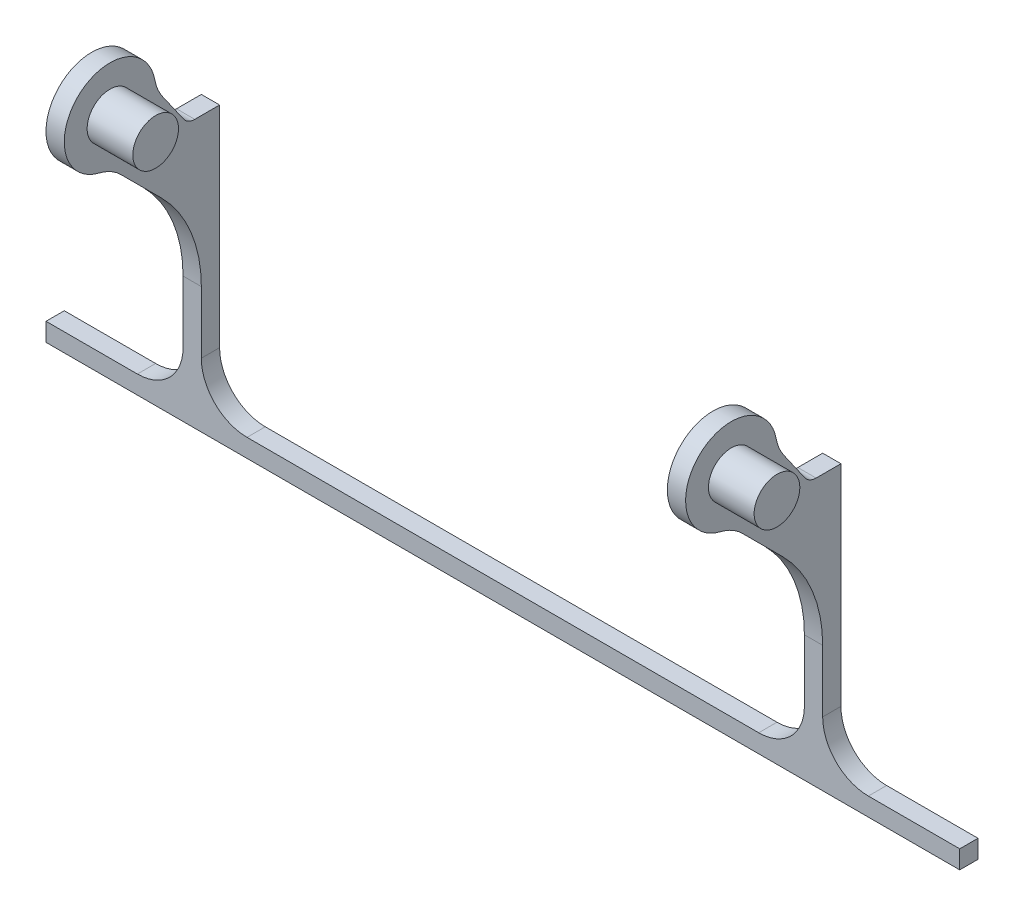
ISO-10303-21;
HEADER;
FILE_DESCRIPTION(('STEP AP214'),'2;1');
FILE_NAME('part.step','',(''),(''),'','','');
FILE_SCHEMA(('AUTOMOTIVE_DESIGN { 1 0 10303 214 1 1 1 1 }'));
ENDSEC;
DATA;
#1=APPLICATION_CONTEXT('core data for automotive mechanical design processes');
#2=APPLICATION_PROTOCOL_DEFINITION('international standard','automotive_design',2000,#1);
#3=PRODUCT_CONTEXT('',#1,'mechanical');
#4=PRODUCT('Part','Part','',(#3));
#5=PRODUCT_RELATED_PRODUCT_CATEGORY('part','',(#4));
#6=PRODUCT_DEFINITION_FORMATION('','',#4);
#7=PRODUCT_DEFINITION_CONTEXT('part definition',#1,'design');
#8=PRODUCT_DEFINITION('design','',#6,#7);
#9=PRODUCT_DEFINITION_SHAPE('','',#8);
#10=(LENGTH_UNIT() NAMED_UNIT(*) SI_UNIT(.MILLI.,.METRE.));
#11=(NAMED_UNIT(*) PLANE_ANGLE_UNIT() SI_UNIT($,.RADIAN.));
#12=(NAMED_UNIT(*) SI_UNIT($,.STERADIAN.) SOLID_ANGLE_UNIT());
#13=UNCERTAINTY_MEASURE_WITH_UNIT(LENGTH_MEASURE(1.E-05),#10,'distance_accuracy_value','');
#14=(GEOMETRIC_REPRESENTATION_CONTEXT(3) GLOBAL_UNCERTAINTY_ASSIGNED_CONTEXT((#13)) GLOBAL_UNIT_ASSIGNED_CONTEXT((#10,
#11,#12)) REPRESENTATION_CONTEXT('',''));
#15=CARTESIAN_POINT('',(0.,0.,0.));
#16=DIRECTION('',(0.,0.,1.));
#17=DIRECTION('',(1.,0.,0.));
#18=AXIS2_PLACEMENT_3D('',#15,#16,#17);
#19=CARTESIAN_POINT('',(100.,-160.,-4.));
#20=DIRECTION('',(0.,-1.,0.));
#21=DIRECTION('',(1.,0.,0.));
#22=AXIS2_PLACEMENT_3D('',#19,#20,#21);
#23=PLANE('',#22);
#24=DIRECTION('',(1.,0.,0.));
#25=VECTOR('',#24,1.);
#26=CARTESIAN_POINT('',(100.,-160.,0.));
#27=LINE('',#26,#25);
#28=CARTESIAN_POINT('',(-100.,-160.,0.));
#29=VERTEX_POINT('',#28);
#30=CARTESIAN_POINT('',(100.,-160.,0.));
#31=VERTEX_POINT('',#30);
#32=EDGE_CURVE('E300',#29,#31,#27,.T.);
#33=ORIENTED_EDGE('',*,*,#32,.F.);
#34=DIRECTION('',(0.,0.,1.));
#35=VECTOR('',#34,1.);
#36=CARTESIAN_POINT('',(-100.,-160.,-4.));
#37=LINE('',#36,#35);
#38=CARTESIAN_POINT('',(-100.,-160.,-4.));
#39=VERTEX_POINT('',#38);
#40=EDGE_CURVE('E356',#39,#29,#37,.T.);
#41=ORIENTED_EDGE('',*,*,#40,.F.);
#42=DIRECTION('',(1.,0.,0.));
#43=VECTOR('',#42,1.);
#44=CARTESIAN_POINT('',(100.,-160.,-4.));
#45=LINE('',#44,#43);
#46=CARTESIAN_POINT('',(100.,-160.,-4.));
#47=VERTEX_POINT('',#46);
#48=EDGE_CURVE('E306',#39,#47,#45,.T.);
#49=ORIENTED_EDGE('',*,*,#48,.T.);
#50=DIRECTION('',(0.,0.,1.));
#51=VECTOR('',#50,1.);
#52=CARTESIAN_POINT('',(100.,-160.,-4.));
#53=LINE('',#52,#51);
#54=EDGE_CURVE('E330',#47,#31,#53,.T.);
#55=ORIENTED_EDGE('',*,*,#54,.T.);
#56=EDGE_LOOP('',(#33,#41,#49,#55));
#57=FACE_BOUND('',#56,.T.);
#58=ADVANCED_FACE('F37',(#57),#23,.T.);
#59=CARTESIAN_POINT('',(-100.,-160.,-4.));
#60=DIRECTION('',(-1.,0.,0.));
#61=DIRECTION('',(0.,0.,1.));
#62=AXIS2_PLACEMENT_3D('',#59,#60,#61);
#63=PLANE('',#62);
#64=DIRECTION('',(0.,-1.,0.));
#65=VECTOR('',#64,1.);
#66=CARTESIAN_POINT('',(-100.,-160.,0.));
#67=LINE('',#66,#65);
#68=CARTESIAN_POINT('',(-100.,-156.,0.));
#69=VERTEX_POINT('',#68);
#70=EDGE_CURVE('E310',#69,#29,#67,.T.);
#71=ORIENTED_EDGE('',*,*,#70,.F.);
#72=DIRECTION('',(0.,0.,1.));
#73=VECTOR('',#72,1.);
#74=CARTESIAN_POINT('',(-100.,-156.,-4.));
#75=LINE('',#74,#73);
#76=CARTESIAN_POINT('',(-100.,-156.,-4.));
#77=VERTEX_POINT('',#76);
#78=EDGE_CURVE('E359',#77,#69,#75,.T.);
#79=ORIENTED_EDGE('',*,*,#78,.F.);
#80=DIRECTION('',(0.,-1.,0.));
#81=VECTOR('',#80,1.);
#82=CARTESIAN_POINT('',(-100.,-160.,-4.));
#83=LINE('',#82,#81);
#84=EDGE_CURVE('E327',#77,#39,#83,.T.);
#85=ORIENTED_EDGE('',*,*,#84,.T.);
#86=ORIENTED_EDGE('',*,*,#40,.T.);
#87=EDGE_LOOP('',(#71,#79,#85,#86));
#88=FACE_BOUND('',#87,.T.);
#89=ADVANCED_FACE('F508',(#88),#63,.T.);
#90=CARTESIAN_POINT('',(-100.,-156.,-4.));
#91=DIRECTION('',(0.,1.,0.));
#92=DIRECTION('',(0.,0.,1.));
#93=AXIS2_PLACEMENT_3D('',#90,#91,#92);
#94=PLANE('',#93);
#95=DIRECTION('',(-1.,0.,0.));
#96=VECTOR('',#95,1.);
#97=CARTESIAN_POINT('',(-100.,-156.,0.));
#98=LINE('',#97,#96);
#99=CARTESIAN_POINT('',(-80.,-156.,0.));
#100=VERTEX_POINT('',#99);
#101=EDGE_CURVE('E352',#100,#69,#98,.T.);
#102=ORIENTED_EDGE('',*,*,#101,.F.);
#103=DIRECTION('',(0.,0.,1.));
#104=VECTOR('',#103,1.);
#105=CARTESIAN_POINT('',(-80.,-156.,-4.));
#106=LINE('',#105,#104);
#107=CARTESIAN_POINT('',(-80.,-156.,-4.));
#108=VERTEX_POINT('',#107);
#109=EDGE_CURVE('E397',#100,#108,#106,.F.);
#110=ORIENTED_EDGE('',*,*,#109,.T.);
#111=DIRECTION('',(-1.,0.,0.));
#112=VECTOR('',#111,1.);
#113=CARTESIAN_POINT('',(-100.,-156.,-4.));
#114=LINE('',#113,#112);
#115=EDGE_CURVE('E325',#108,#77,#114,.T.);
#116=ORIENTED_EDGE('',*,*,#115,.T.);
#117=ORIENTED_EDGE('',*,*,#78,.T.);
#118=EDGE_LOOP('',(#102,#110,#116,#117));
#119=FACE_BOUND('',#118,.T.);
#120=ADVANCED_FACE('F503',(#119),#94,.T.);
#121=CARTESIAN_POINT('',(-70.,-156.,-4.));
#122=DIRECTION('',(-1.,0.,0.));
#123=DIRECTION('',(0.,0.,1.));
#124=AXIS2_PLACEMENT_3D('',#121,#122,#123);
#125=PLANE('',#124);
#126=CARTESIAN_POINT('',(-70.,-90.0000000000001,20.));
#127=DIRECTION('',(-1.,0.,0.));
#128=DIRECTION('',(0.,-1.,0.));
#129=AXIS2_PLACEMENT_3D('',#126,#127,#128);
#130=CIRCLE('',#129,10.);
#131=CARTESIAN_POINT('',(-70.,-99.7195983014525,22.351469510413));
#132=VERTEX_POINT('',#131);
#133=CARTESIAN_POINT('',(-70.,-88.1871950124291,10.1656856834328));
#134=VERTEX_POINT('',#133);
#135=EDGE_CURVE('E287',#132,#134,#130,.T.);
#136=ORIENTED_EDGE('',*,*,#135,.T.);
#137=CARTESIAN_POINT('',(-70.,-86.3743900248581,0.331371366865695));
#138=DIRECTION('',(-1.,0.,0.));
#139=DIRECTION('',(0.,0.,1.));
#140=AXIS2_PLACEMENT_3D('',#137,#138,#139);
#141=CIRCLE('',#140,10.);
#142=CARTESIAN_POINT('',(-70.,-92.1090134684913,8.52369057205609));
#143=VERTEX_POINT('',#142);
#144=EDGE_CURVE('E446',#134,#143,#141,.F.);
#145=ORIENTED_EDGE('',*,*,#144,.T.);
#146=DIRECTION('',(0.,-0.81923192051904,-0.573462344363329));
#147=VECTOR('',#146,1.);
#148=CARTESIAN_POINT('',(-70.,-110.,-4.));
#149=LINE('',#148,#147);
#150=CARTESIAN_POINT('',(-70.,-98.72038703309,3.89572907683706));
#151=VERTEX_POINT('',#150);
#152=EDGE_CURVE('E278',#143,#151,#149,.T.);
#153=ORIENTED_EDGE('',*,*,#152,.T.);
#154=CARTESIAN_POINT('',(-70.,-97.,1.43803331527994));
#155=DIRECTION('',(-1.,0.,0.));
#156=DIRECTION('',(0.,0.,1.));
#157=AXIS2_PLACEMENT_3D('',#154,#155,#156);
#158=CIRCLE('',#157,3.);
#159=CARTESIAN_POINT('',(-70.,-100.,1.43803331527994));
#160=VERTEX_POINT('',#159);
#161=EDGE_CURVE('E467',#151,#160,#158,.F.);
#162=ORIENTED_EDGE('',*,*,#161,.T.);
#163=DIRECTION('',(0.,0.,-1.));
#164=VECTOR('',#163,1.);
#165=CARTESIAN_POINT('',(-70.,-100.,-4.));
#166=LINE('',#165,#164);
#167=CARTESIAN_POINT('',(-70.,-100.,-4.));
#168=VERTEX_POINT('',#167);
#169=EDGE_CURVE('E256',#160,#168,#166,.T.);
#170=ORIENTED_EDGE('',*,*,#169,.T.);
#171=DIRECTION('',(0.,-1.,0.));
#172=VECTOR('',#171,1.);
#173=CARTESIAN_POINT('',(-70.,-156.,-4.));
#174=LINE('',#173,#172);
#175=CARTESIAN_POINT('',(-70.,-146.,-4.));
#176=VERTEX_POINT('',#175);
#177=EDGE_CURVE('E322',#168,#176,#174,.T.);
#178=ORIENTED_EDGE('',*,*,#177,.T.);
#179=DIRECTION('',(0.,0.,1.));
#180=VECTOR('',#179,1.);
#181=CARTESIAN_POINT('',(-70.,-146.,0.));
#182=LINE('',#181,#180);
#183=CARTESIAN_POINT('',(-70.,-146.,0.));
#184=VERTEX_POINT('',#183);
#185=EDGE_CURVE('E394',#176,#184,#182,.T.);
#186=ORIENTED_EDGE('',*,*,#185,.T.);
#187=DIRECTION('',(0.,-1.,0.));
#188=VECTOR('',#187,1.);
#189=CARTESIAN_POINT('',(-70.,-156.,0.));
#190=LINE('',#189,#188);
#191=CARTESIAN_POINT('',(-70.,-132.426406871193,0.));
#192=VERTEX_POINT('',#191);
#193=EDGE_CURVE('E349',#192,#184,#190,.T.);
#194=ORIENTED_EDGE('',*,*,#193,.F.);
#195=CARTESIAN_POINT('',(-70.,-132.426406871193,30.));
#196=DIRECTION('',(-1.,0.,0.));
#197=DIRECTION('',(0.,0.,1.));
#198=AXIS2_PLACEMENT_3D('',#195,#196,#197);
#199=CIRCLE('',#198,30.);
#200=CARTESIAN_POINT('',(-70.,-111.213203435596,8.78679656440358));
#201=VERTEX_POINT('',#200);
#202=EDGE_CURVE('E380',#192,#201,#199,.F.);
#203=ORIENTED_EDGE('',*,*,#202,.T.);
#204=DIRECTION('',(0.,0.707106781186548,0.707106781186547));
#205=VECTOR('',#204,1.);
#206=CARTESIAN_POINT('',(-70.,-100.,20.));
#207=LINE('',#206,#205);
#208=CARTESIAN_POINT('',(-70.,-102.36812879104,17.6318712089605));
#209=VERTEX_POINT('',#208);
#210=EDGE_CURVE('E273',#201,#209,#207,.T.);
#211=ORIENTED_EDGE('',*,*,#210,.T.);
#212=CARTESIAN_POINT('',(-70.,-109.439196602905,24.702939020826));
#213=DIRECTION('',(-1.,0.,0.));
#214=DIRECTION('',(0.,0.,1.));
#215=AXIS2_PLACEMENT_3D('',#212,#213,#214);
#216=CIRCLE('',#215,10.);
#217=EDGE_CURVE('E442',#209,#132,#216,.F.);
#218=ORIENTED_EDGE('',*,*,#217,.T.);
#219=EDGE_LOOP('',(#136,#145,#153,#162,#170,#178,#186,#194,#203,#211,#218));
#220=FACE_BOUND('',#219,.T.);
#221=ADVANCED_FACE('F486',(#220),#125,.T.);
#222=CARTESIAN_POINT('',(-66.,-110.,-4.));
#223=DIRECTION('',(1.,0.,0.));
#224=DIRECTION('',(0.,0.,-1.));
#225=AXIS2_PLACEMENT_3D('',#222,#223,#224);
#226=PLANE('',#225);
#227=CARTESIAN_POINT('',(-66.,-90.,20.));
#228=DIRECTION('',(1.,0.,0.));
#229=DIRECTION('',(0.,0.,-1.));
#230=AXIS2_PLACEMENT_3D('',#227,#228,#229);
#231=CIRCLE('',#230,5.);
#232=CARTESIAN_POINT('',(-66.,-90.,15.));
#233=VERTEX_POINT('',#232);
#234=EDGE_CURVE('E419',#233,#233,#231,.T.);
#235=ORIENTED_EDGE('',*,*,#234,.F.);
#236=EDGE_LOOP('',(#235));
#237=FACE_BOUND('',#236,.T.);
#238=DIRECTION('',(0.,1.,0.));
#239=VECTOR('',#238,1.);
#240=CARTESIAN_POINT('',(-66.,-110.,-4.));
#241=LINE('',#240,#239);
#242=CARTESIAN_POINT('',(-66.,-146.,-4.));
#243=VERTEX_POINT('',#242);
#244=CARTESIAN_POINT('',(-66.,-100.,-4.));
#245=VERTEX_POINT('',#244);
#246=EDGE_CURVE('E319',#243,#245,#241,.T.);
#247=ORIENTED_EDGE('',*,*,#246,.T.);
#248=DIRECTION('',(0.,0.,-1.));
#249=VECTOR('',#248,1.);
#250=CARTESIAN_POINT('',(-66.,-100.,-4.));
#251=LINE('',#250,#249);
#252=CARTESIAN_POINT('',(-66.,-100.,1.43803331527994));
#253=VERTEX_POINT('',#252);
#254=EDGE_CURVE('E267',#253,#245,#251,.T.);
#255=ORIENTED_EDGE('',*,*,#254,.F.);
#256=CARTESIAN_POINT('',(-66.,-97.,1.43803331527994));
#257=DIRECTION('',(1.,0.,0.));
#258=DIRECTION('',(0.,0.,-1.));
#259=AXIS2_PLACEMENT_3D('',#256,#257,#258);
#260=CIRCLE('',#259,3.);
#261=CARTESIAN_POINT('',(-66.,-98.72038703309,3.89572907683706));
#262=VERTEX_POINT('',#261);
#263=EDGE_CURVE('E469',#253,#262,#260,.F.);
#264=ORIENTED_EDGE('',*,*,#263,.T.);
#265=DIRECTION('',(0.,-0.81923192051904,-0.573462344363329));
#266=VECTOR('',#265,1.);
#267=CARTESIAN_POINT('',(-66.,-110.,-4.));
#268=LINE('',#267,#266);
#269=CARTESIAN_POINT('',(-66.,-92.1090134684913,8.52369057205609));
#270=VERTEX_POINT('',#269);
#271=EDGE_CURVE('E281',#270,#262,#268,.T.);
#272=ORIENTED_EDGE('',*,*,#271,.F.);
#273=CARTESIAN_POINT('',(-66.,-86.3743900248581,0.331371366865695));
#274=DIRECTION('',(1.,0.,0.));
#275=DIRECTION('',(0.,0.,-1.));
#276=AXIS2_PLACEMENT_3D('',#273,#274,#275);
#277=CIRCLE('',#276,10.);
#278=CARTESIAN_POINT('',(-66.,-88.1871950124291,10.1656856834328));
#279=VERTEX_POINT('',#278);
#280=EDGE_CURVE('E448',#270,#279,#277,.F.);
#281=ORIENTED_EDGE('',*,*,#280,.T.);
#282=CARTESIAN_POINT('',(-66.,-90.0000000000001,20.));
#283=DIRECTION('',(-1.,0.,0.));
#284=DIRECTION('',(0.,-1.,0.));
#285=AXIS2_PLACEMENT_3D('',#282,#283,#284);
#286=CIRCLE('',#285,10.);
#287=CARTESIAN_POINT('',(-66.,-99.7195983014525,22.351469510413));
#288=VERTEX_POINT('',#287);
#289=EDGE_CURVE('E277',#288,#279,#286,.T.);
#290=ORIENTED_EDGE('',*,*,#289,.F.);
#291=CARTESIAN_POINT('',(-66.,-109.439196602905,24.702939020826));
#292=DIRECTION('',(1.,0.,0.));
#293=DIRECTION('',(0.,0.,-1.));
#294=AXIS2_PLACEMENT_3D('',#291,#292,#293);
#295=CIRCLE('',#294,10.);
#296=CARTESIAN_POINT('',(-66.,-102.36812879104,17.6318712089605));
#297=VERTEX_POINT('',#296);
#298=EDGE_CURVE('E444',#288,#297,#295,.F.);
#299=ORIENTED_EDGE('',*,*,#298,.T.);
#300=DIRECTION('',(0.,0.707106781186548,0.707106781186547));
#301=VECTOR('',#300,1.);
#302=CARTESIAN_POINT('',(-66.,-100.,20.));
#303=LINE('',#302,#301);
#304=CARTESIAN_POINT('',(-66.,-111.213203435596,8.78679656440358));
#305=VERTEX_POINT('',#304);
#306=EDGE_CURVE('E274',#305,#297,#303,.T.);
#307=ORIENTED_EDGE('',*,*,#306,.F.);
#308=CARTESIAN_POINT('',(-66.,-132.426406871193,30.));
#309=DIRECTION('',(1.,0.,0.));
#310=DIRECTION('',(0.,0.,-1.));
#311=AXIS2_PLACEMENT_3D('',#308,#309,#310);
#312=CIRCLE('',#311,30.);
#313=CARTESIAN_POINT('',(-66.,-132.426406871193,0.));
#314=VERTEX_POINT('',#313);
#315=EDGE_CURVE('E382',#305,#314,#312,.F.);
#316=ORIENTED_EDGE('',*,*,#315,.T.);
#317=DIRECTION('',(0.,1.,0.));
#318=VECTOR('',#317,1.);
#319=CARTESIAN_POINT('',(-66.,-110.,0.));
#320=LINE('',#319,#318);
#321=CARTESIAN_POINT('',(-66.,-146.,0.));
#322=VERTEX_POINT('',#321);
#323=EDGE_CURVE('E347',#322,#314,#320,.T.);
#324=ORIENTED_EDGE('',*,*,#323,.F.);
#325=DIRECTION('',(0.,0.,1.));
#326=VECTOR('',#325,1.);
#327=CARTESIAN_POINT('',(-66.,-146.,-4.));
#328=LINE('',#327,#326);
#329=EDGE_CURVE('E392',#322,#243,#328,.F.);
#330=ORIENTED_EDGE('',*,*,#329,.T.);
#331=EDGE_LOOP('',(#247,#255,#264,#272,#281,#290,#299,#307,#316,#324,#330));
#332=FACE_BOUND('',#331,.T.);
#333=ADVANCED_FACE('F474',(#237,#332),#226,.T.);
#334=CARTESIAN_POINT('',(-66.,-156.,-4.));
#335=DIRECTION('',(0.,1.,0.));
#336=DIRECTION('',(0.,0.,1.));
#337=AXIS2_PLACEMENT_3D('',#334,#335,#336);
#338=PLANE('',#337);
#339=DIRECTION('',(-1.,0.,0.));
#340=VECTOR('',#339,1.);
#341=CARTESIAN_POINT('',(-66.,-156.,0.));
#342=LINE('',#341,#340);
#343=CARTESIAN_POINT('',(56.,-156.,0.));
#344=VERTEX_POINT('',#343);
#345=CARTESIAN_POINT('',(-56.,-156.,0.));
#346=VERTEX_POINT('',#345);
#347=EDGE_CURVE('E344',#344,#346,#342,.T.);
#348=ORIENTED_EDGE('',*,*,#347,.F.);
#349=DIRECTION('',(0.,0.,1.));
#350=VECTOR('',#349,1.);
#351=CARTESIAN_POINT('',(56.,-156.,-4.));
#352=LINE('',#351,#350);
#353=CARTESIAN_POINT('',(56.,-156.,-4.));
#354=VERTEX_POINT('',#353);
#355=EDGE_CURVE('E390',#344,#354,#352,.F.);
#356=ORIENTED_EDGE('',*,*,#355,.T.);
#357=DIRECTION('',(-1.,0.,0.));
#358=VECTOR('',#357,1.);
#359=CARTESIAN_POINT('',(-66.,-156.,-4.));
#360=LINE('',#359,#358);
#361=CARTESIAN_POINT('',(-56.,-156.,-4.));
#362=VERTEX_POINT('',#361);
#363=EDGE_CURVE('E246',#354,#362,#360,.T.);
#364=ORIENTED_EDGE('',*,*,#363,.T.);
#365=DIRECTION('',(0.,0.,1.));
#366=VECTOR('',#365,1.);
#367=CARTESIAN_POINT('',(-56.,-156.,0.));
#368=LINE('',#367,#366);
#369=EDGE_CURVE('E387',#362,#346,#368,.T.);
#370=ORIENTED_EDGE('',*,*,#369,.T.);
#371=EDGE_LOOP('',(#348,#356,#364,#370));
#372=FACE_BOUND('',#371,.T.);
#373=ADVANCED_FACE('F569',(#372),#338,.T.);
#374=CARTESIAN_POINT('',(66.,-156.,-4.));
#375=DIRECTION('',(-1.,0.,0.));
#376=DIRECTION('',(0.,-1.,0.));
#377=AXIS2_PLACEMENT_3D('',#374,#375,#376);
#378=PLANE('',#377);
#379=DIRECTION('',(0.,0.819231920519041,0.573462344363328));
#380=VECTOR('',#379,1.);
#381=CARTESIAN_POINT('',(66.,-110.,-4.));
#382=LINE('',#381,#380);
#383=CARTESIAN_POINT('',(66.,-98.72038703309,3.89572907683703));
#384=VERTEX_POINT('',#383);
#385=CARTESIAN_POINT('',(66.,-92.1090134684913,8.52369057205611));
#386=VERTEX_POINT('',#385);
#387=EDGE_CURVE('E292',#384,#386,#382,.T.);
#388=ORIENTED_EDGE('',*,*,#387,.F.);
#389=CARTESIAN_POINT('',(66.,-97.,1.43803331527991));
#390=DIRECTION('',(-1.,0.,0.));
#391=DIRECTION('',(0.,-1.,0.));
#392=AXIS2_PLACEMENT_3D('',#389,#390,#391);
#393=CIRCLE('',#392,3.);
#394=CARTESIAN_POINT('',(66.,-100.,1.43803331527991));
#395=VERTEX_POINT('',#394);
#396=EDGE_CURVE('E11',#384,#395,#393,.F.);
#397=ORIENTED_EDGE('',*,*,#396,.T.);
#398=DIRECTION('',(0.,0.,1.));
#399=VECTOR('',#398,1.);
#400=CARTESIAN_POINT('',(66.,-100.,-4.));
#401=LINE('',#400,#399);
#402=CARTESIAN_POINT('',(66.,-100.,-4.));
#403=VERTEX_POINT('',#402);
#404=EDGE_CURVE('E253',#403,#395,#401,.T.);
#405=ORIENTED_EDGE('',*,*,#404,.F.);
#406=DIRECTION('',(0.,-1.,0.));
#407=VECTOR('',#406,1.);
#408=CARTESIAN_POINT('',(66.,-156.,-4.));
#409=LINE('',#408,#407);
#410=CARTESIAN_POINT('',(66.,-146.,-4.));
#411=VERTEX_POINT('',#410);
#412=EDGE_CURVE('E232',#403,#411,#409,.T.);
#413=ORIENTED_EDGE('',*,*,#412,.T.);
#414=DIRECTION('',(0.,0.,1.));
#415=VECTOR('',#414,1.);
#416=CARTESIAN_POINT('',(66.,-146.,0.));
#417=LINE('',#416,#415);
#418=CARTESIAN_POINT('',(66.,-146.,0.));
#419=VERTEX_POINT('',#418);
#420=EDGE_CURVE('E385',#411,#419,#417,.T.);
#421=ORIENTED_EDGE('',*,*,#420,.T.);
#422=DIRECTION('',(0.,-1.,0.));
#423=VECTOR('',#422,1.);
#424=CARTESIAN_POINT('',(66.,-156.,0.));
#425=LINE('',#424,#423);
#426=CARTESIAN_POINT('',(66.,-132.426406871193,0.));
#427=VERTEX_POINT('',#426);
#428=EDGE_CURVE('E341',#427,#419,#425,.T.);
#429=ORIENTED_EDGE('',*,*,#428,.F.);
#430=CARTESIAN_POINT('',(66.,-132.426406871193,30.));
#431=DIRECTION('',(-1.,0.,0.));
#432=DIRECTION('',(0.,-1.,0.));
#433=AXIS2_PLACEMENT_3D('',#430,#431,#432);
#434=CIRCLE('',#433,30.);
#435=CARTESIAN_POINT('',(66.,-111.213203435596,8.78679656440357));
#436=VERTEX_POINT('',#435);
#437=EDGE_CURVE('E377',#427,#436,#434,.F.);
#438=ORIENTED_EDGE('',*,*,#437,.T.);
#439=DIRECTION('',(0.,-0.707106781186548,-0.707106781186547));
#440=VECTOR('',#439,1.);
#441=CARTESIAN_POINT('',(66.,-120.,0.));
#442=LINE('',#441,#440);
#443=CARTESIAN_POINT('',(66.,-102.36812879104,17.6318712089605));
#444=VERTEX_POINT('',#443);
#445=EDGE_CURVE('E298',#444,#436,#442,.T.);
#446=ORIENTED_EDGE('',*,*,#445,.F.);
#447=CARTESIAN_POINT('',(66.,-109.439196602905,24.702939020826));
#448=DIRECTION('',(-1.,0.,0.));
#449=DIRECTION('',(0.,-1.,0.));
#450=AXIS2_PLACEMENT_3D('',#447,#448,#449);
#451=CIRCLE('',#450,10.);
#452=CARTESIAN_POINT('',(66.,-99.7195983014525,22.351469510413));
#453=VERTEX_POINT('',#452);
#454=EDGE_CURVE('E457',#444,#453,#451,.F.);
#455=ORIENTED_EDGE('',*,*,#454,.T.);
#456=CARTESIAN_POINT('',(66.,-90.,20.));
#457=DIRECTION('',(1.,0.,0.));
#458=DIRECTION('',(0.,1.,0.));
#459=AXIS2_PLACEMENT_3D('',#456,#457,#458);
#460=CIRCLE('',#459,10.);
#461=CARTESIAN_POINT('',(66.,-88.187195012429,10.1656856834328));
#462=VERTEX_POINT('',#461);
#463=EDGE_CURVE('E294',#462,#453,#460,.T.);
#464=ORIENTED_EDGE('',*,*,#463,.F.);
#465=CARTESIAN_POINT('',(66.,-86.374390024858,0.331371366865698));
#466=DIRECTION('',(-1.,0.,0.));
#467=DIRECTION('',(0.,-1.,0.));
#468=AXIS2_PLACEMENT_3D('',#465,#466,#467);
#469=CIRCLE('',#468,10.);
#470=EDGE_CURVE('E452',#462,#386,#469,.F.);
#471=ORIENTED_EDGE('',*,*,#470,.T.);
#472=EDGE_LOOP('',(#388,#397,#405,#413,#421,#429,#438,#446,#455,#464,#471));
#473=FACE_BOUND('',#472,.T.);
#474=ADVANCED_FACE('F258',(#473),#378,.T.);
#475=CARTESIAN_POINT('',(70.,-110.,-4.));
#476=DIRECTION('',(1.,0.,0.));
#477=DIRECTION('',(0.,0.,-1.));
#478=AXIS2_PLACEMENT_3D('',#475,#476,#477);
#479=PLANE('',#478);
#480=CARTESIAN_POINT('',(70.,-90.,20.));
#481=DIRECTION('',(1.,0.,0.));
#482=DIRECTION('',(0.,1.,0.));
#483=AXIS2_PLACEMENT_3D('',#480,#481,#482);
#484=CIRCLE('',#483,5.);
#485=CARTESIAN_POINT('',(70.,-85.,20.));
#486=VERTEX_POINT('',#485);
#487=EDGE_CURVE('E264',#486,#486,#484,.T.);
#488=ORIENTED_EDGE('',*,*,#487,.F.);
#489=EDGE_LOOP('',(#488));
#490=FACE_BOUND('',#489,.T.);
#491=DIRECTION('',(0.,1.,0.));
#492=VECTOR('',#491,1.);
#493=CARTESIAN_POINT('',(70.,-110.,-4.));
#494=LINE('',#493,#492);
#495=CARTESIAN_POINT('',(70.,-146.,-4.));
#496=VERTEX_POINT('',#495);
#497=CARTESIAN_POINT('',(70.,-100.,-4.));
#498=VERTEX_POINT('',#497);
#499=EDGE_CURVE('E247',#496,#498,#494,.T.);
#500=ORIENTED_EDGE('',*,*,#499,.T.);
#501=DIRECTION('',(0.,0.,1.));
#502=VECTOR('',#501,1.);
#503=CARTESIAN_POINT('',(70.,-100.,-4.));
#504=LINE('',#503,#502);
#505=CARTESIAN_POINT('',(70.,-100.,1.43803331527991));
#506=VERTEX_POINT('',#505);
#507=EDGE_CURVE('E255',#498,#506,#504,.T.);
#508=ORIENTED_EDGE('',*,*,#507,.T.);
#509=CARTESIAN_POINT('',(70.,-97.,1.43803331527991));
#510=DIRECTION('',(1.,0.,0.));
#511=DIRECTION('',(0.,0.,-1.));
#512=AXIS2_PLACEMENT_3D('',#509,#510,#511);
#513=CIRCLE('',#512,3.);
#514=CARTESIAN_POINT('',(70.,-98.72038703309,3.89572907683703));
#515=VERTEX_POINT('',#514);
#516=EDGE_CURVE('E45',#506,#515,#513,.F.);
#517=ORIENTED_EDGE('',*,*,#516,.T.);
#518=DIRECTION('',(0.,0.819231920519041,0.573462344363328));
#519=VECTOR('',#518,1.);
#520=CARTESIAN_POINT('',(70.,-110.,-4.));
#521=LINE('',#520,#519);
#522=CARTESIAN_POINT('',(70.,-92.1090134684913,8.52369057205611));
#523=VERTEX_POINT('',#522);
#524=EDGE_CURVE('E284',#515,#523,#521,.T.);
#525=ORIENTED_EDGE('',*,*,#524,.T.);
#526=CARTESIAN_POINT('',(70.,-86.374390024858,0.331371366865698));
#527=DIRECTION('',(1.,0.,0.));
#528=DIRECTION('',(0.,0.,-1.));
#529=AXIS2_PLACEMENT_3D('',#526,#527,#528);
#530=CIRCLE('',#529,10.);
#531=CARTESIAN_POINT('',(70.,-88.187195012429,10.1656856834328));
#532=VERTEX_POINT('',#531);
#533=EDGE_CURVE('E450',#523,#532,#530,.F.);
#534=ORIENTED_EDGE('',*,*,#533,.T.);
#535=CARTESIAN_POINT('',(70.,-90.,20.));
#536=DIRECTION('',(1.,0.,0.));
#537=DIRECTION('',(0.,1.,0.));
#538=AXIS2_PLACEMENT_3D('',#535,#536,#537);
#539=CIRCLE('',#538,10.);
#540=CARTESIAN_POINT('',(70.,-99.7195983014525,22.351469510413));
#541=VERTEX_POINT('',#540);
#542=EDGE_CURVE('E302',#532,#541,#539,.T.);
#543=ORIENTED_EDGE('',*,*,#542,.T.);
#544=CARTESIAN_POINT('',(70.,-109.439196602905,24.702939020826));
#545=DIRECTION('',(1.,0.,0.));
#546=DIRECTION('',(0.,0.,-1.));
#547=AXIS2_PLACEMENT_3D('',#544,#545,#546);
#548=CIRCLE('',#547,10.);
#549=CARTESIAN_POINT('',(70.,-102.36812879104,17.6318712089605));
#550=VERTEX_POINT('',#549);
#551=EDGE_CURVE('E455',#541,#550,#548,.F.);
#552=ORIENTED_EDGE('',*,*,#551,.T.);
#553=DIRECTION('',(0.,-0.707106781186548,-0.707106781186547));
#554=VECTOR('',#553,1.);
#555=CARTESIAN_POINT('',(70.,-120.,0.));
#556=LINE('',#555,#554);
#557=CARTESIAN_POINT('',(70.,-111.213203435596,8.78679656440357));
#558=VERTEX_POINT('',#557);
#559=EDGE_CURVE('E295',#550,#558,#556,.T.);
#560=ORIENTED_EDGE('',*,*,#559,.T.);
#561=CARTESIAN_POINT('',(70.,-132.426406871193,30.));
#562=DIRECTION('',(1.,0.,0.));
#563=DIRECTION('',(0.,0.,-1.));
#564=AXIS2_PLACEMENT_3D('',#561,#562,#563);
#565=CIRCLE('',#564,30.);
#566=CARTESIAN_POINT('',(70.,-132.426406871193,0.));
#567=VERTEX_POINT('',#566);
#568=EDGE_CURVE('E374',#558,#567,#565,.F.);
#569=ORIENTED_EDGE('',*,*,#568,.T.);
#570=DIRECTION('',(0.,1.,0.));
#571=VECTOR('',#570,1.);
#572=CARTESIAN_POINT('',(70.,-110.,0.));
#573=LINE('',#572,#571);
#574=CARTESIAN_POINT('',(70.,-146.,0.));
#575=VERTEX_POINT('',#574);
#576=EDGE_CURVE('E339',#575,#567,#573,.T.);
#577=ORIENTED_EDGE('',*,*,#576,.F.);
#578=DIRECTION('',(0.,0.,1.));
#579=VECTOR('',#578,1.);
#580=CARTESIAN_POINT('',(70.,-146.,-4.));
#581=LINE('',#580,#579);
#582=EDGE_CURVE('E402',#575,#496,#581,.F.);
#583=ORIENTED_EDGE('',*,*,#582,.T.);
#584=EDGE_LOOP('',(#500,#508,#517,#525,#534,#543,#552,#560,#569,#577,#583));
#585=FACE_BOUND('',#584,.T.);
#586=ADVANCED_FACE('F524',(#490,#585),#479,.T.);
#587=CARTESIAN_POINT('',(70.,-156.,-4.));
#588=DIRECTION('',(0.,1.,0.));
#589=DIRECTION('',(0.,0.,1.));
#590=AXIS2_PLACEMENT_3D('',#587,#588,#589);
#591=PLANE('',#590);
#592=DIRECTION('',(-1.,0.,0.));
#593=VECTOR('',#592,1.);
#594=CARTESIAN_POINT('',(70.,-156.,-4.));
#595=LINE('',#594,#593);
#596=CARTESIAN_POINT('',(100.,-156.,-4.));
#597=VERTEX_POINT('',#596);
#598=CARTESIAN_POINT('',(80.,-156.,-4.));
#599=VERTEX_POINT('',#598);
#600=EDGE_CURVE('E313',#597,#599,#595,.T.);
#601=ORIENTED_EDGE('',*,*,#600,.T.);
#602=DIRECTION('',(0.,0.,1.));
#603=VECTOR('',#602,1.);
#604=CARTESIAN_POINT('',(80.,-156.,0.));
#605=LINE('',#604,#603);
#606=CARTESIAN_POINT('',(80.,-156.,0.));
#607=VERTEX_POINT('',#606);
#608=EDGE_CURVE('E399',#599,#607,#605,.T.);
#609=ORIENTED_EDGE('',*,*,#608,.T.);
#610=DIRECTION('',(-1.,0.,0.));
#611=VECTOR('',#610,1.);
#612=CARTESIAN_POINT('',(70.,-156.,0.));
#613=LINE('',#612,#611);
#614=CARTESIAN_POINT('',(100.,-156.,0.));
#615=VERTEX_POINT('',#614);
#616=EDGE_CURVE('E336',#615,#607,#613,.T.);
#617=ORIENTED_EDGE('',*,*,#616,.F.);
#618=DIRECTION('',(0.,0.,1.));
#619=VECTOR('',#618,1.);
#620=CARTESIAN_POINT('',(100.,-156.,-4.));
#621=LINE('',#620,#619);
#622=EDGE_CURVE('E362',#597,#615,#621,.T.);
#623=ORIENTED_EDGE('',*,*,#622,.F.);
#624=EDGE_LOOP('',(#601,#609,#617,#623));
#625=FACE_BOUND('',#624,.T.);
#626=ADVANCED_FACE('F519',(#625),#591,.T.);
#627=CARTESIAN_POINT('',(100.,-156.,-4.));
#628=DIRECTION('',(1.,0.,0.));
#629=DIRECTION('',(0.,0.,-1.));
#630=AXIS2_PLACEMENT_3D('',#627,#628,#629);
#631=PLANE('',#630);
#632=DIRECTION('',(0.,1.,0.));
#633=VECTOR('',#632,1.);
#634=CARTESIAN_POINT('',(100.,-156.,0.));
#635=LINE('',#634,#633);
#636=EDGE_CURVE('E333',#31,#615,#635,.T.);
#637=ORIENTED_EDGE('',*,*,#636,.F.);
#638=ORIENTED_EDGE('',*,*,#54,.F.);
#639=DIRECTION('',(0.,1.,0.));
#640=VECTOR('',#639,1.);
#641=CARTESIAN_POINT('',(100.,-156.,-4.));
#642=LINE('',#641,#640);
#643=EDGE_CURVE('E309',#47,#597,#642,.T.);
#644=ORIENTED_EDGE('',*,*,#643,.T.);
#645=ORIENTED_EDGE('',*,*,#622,.T.);
#646=EDGE_LOOP('',(#637,#638,#644,#645));
#647=FACE_BOUND('',#646,.T.);
#648=ADVANCED_FACE('F515',(#647),#631,.T.);
#649=CARTESIAN_POINT('',(0.,0.,-4.));
#650=DIRECTION('',(0.,0.,-1.));
#651=DIRECTION('',(-1.,0.,0.));
#652=AXIS2_PLACEMENT_3D('',#649,#650,#651);
#653=PLANE('',#652);
#654=ORIENTED_EDGE('',*,*,#177,.F.);
#655=DIRECTION('',(-1.,0.,0.));
#656=VECTOR('',#655,1.);
#657=CARTESIAN_POINT('',(-66.,-100.,-4.));
#658=LINE('',#657,#656);
#659=EDGE_CURVE('E269',#245,#168,#658,.T.);
#660=ORIENTED_EDGE('',*,*,#659,.F.);
#661=ORIENTED_EDGE('',*,*,#246,.F.);
#662=CARTESIAN_POINT('',(-56.,-146.,-4.));
#663=DIRECTION('',(0.,0.,-1.));
#664=DIRECTION('',(-1.,0.,0.));
#665=AXIS2_PLACEMENT_3D('',#662,#663,#664);
#666=CIRCLE('',#665,10.);
#667=EDGE_CURVE('E409',#243,#362,#666,.F.);
#668=ORIENTED_EDGE('',*,*,#667,.T.);
#669=ORIENTED_EDGE('',*,*,#363,.F.);
#670=CARTESIAN_POINT('',(56.,-146.,-4.));
#671=DIRECTION('',(0.,0.,-1.));
#672=DIRECTION('',(-1.,0.,0.));
#673=AXIS2_PLACEMENT_3D('',#670,#671,#672);
#674=CIRCLE('',#673,10.);
#675=EDGE_CURVE('E241',#354,#411,#674,.F.);
#676=ORIENTED_EDGE('',*,*,#675,.T.);
#677=ORIENTED_EDGE('',*,*,#412,.F.);
#678=DIRECTION('',(1.,0.,0.));
#679=VECTOR('',#678,1.);
#680=CARTESIAN_POINT('',(66.,-100.,-4.));
#681=LINE('',#680,#679);
#682=EDGE_CURVE('E237',#403,#498,#681,.T.);
#683=ORIENTED_EDGE('',*,*,#682,.T.);
#684=ORIENTED_EDGE('',*,*,#499,.F.);
#685=CARTESIAN_POINT('',(80.,-146.,-4.));
#686=DIRECTION('',(0.,0.,-1.));
#687=DIRECTION('',(-1.,0.,0.));
#688=AXIS2_PLACEMENT_3D('',#685,#686,#687);
#689=CIRCLE('',#688,10.);
#690=EDGE_CURVE('E417',#496,#599,#689,.F.);
#691=ORIENTED_EDGE('',*,*,#690,.T.);
#692=ORIENTED_EDGE('',*,*,#600,.F.);
#693=ORIENTED_EDGE('',*,*,#643,.F.);
#694=ORIENTED_EDGE('',*,*,#48,.F.);
#695=ORIENTED_EDGE('',*,*,#84,.F.);
#696=ORIENTED_EDGE('',*,*,#115,.F.);
#697=CARTESIAN_POINT('',(-80.,-146.,-4.));
#698=DIRECTION('',(0.,0.,-1.));
#699=DIRECTION('',(-1.,0.,0.));
#700=AXIS2_PLACEMENT_3D('',#697,#698,#699);
#701=CIRCLE('',#700,10.);
#702=EDGE_CURVE('E413',#108,#176,#701,.F.);
#703=ORIENTED_EDGE('',*,*,#702,.T.);
#704=EDGE_LOOP('',(#654,#660,#661,#668,#669,#676,#677,#683,#684,#691,#692,#693,#694,#695,#696,#703));
#705=FACE_BOUND('',#704,.T.);
#706=ADVANCED_FACE('F235',(#705),#653,.T.);
#707=CARTESIAN_POINT('',(0.,0.,0.));
#708=DIRECTION('',(0.,0.,-1.));
#709=DIRECTION('',(-1.,0.,0.));
#710=AXIS2_PLACEMENT_3D('',#707,#708,#709);
#711=PLANE('',#710);
#712=ORIENTED_EDGE('',*,*,#616,.T.);
#713=CARTESIAN_POINT('',(80.,-146.,0.));
#714=DIRECTION('',(0.,0.,-1.));
#715=DIRECTION('',(-1.,0.,0.));
#716=AXIS2_PLACEMENT_3D('',#713,#714,#715);
#717=CIRCLE('',#716,10.);
#718=EDGE_CURVE('E415',#607,#575,#717,.T.);
#719=ORIENTED_EDGE('',*,*,#718,.T.);
#720=ORIENTED_EDGE('',*,*,#576,.T.);
#721=DIRECTION('',(1.,0.,0.));
#722=VECTOR('',#721,1.);
#723=CARTESIAN_POINT('',(0.,-132.426406871193,0.));
#724=LINE('',#723,#722);
#725=EDGE_CURVE('E370',#567,#427,#724,.F.);
#726=ORIENTED_EDGE('',*,*,#725,.T.);
#727=ORIENTED_EDGE('',*,*,#428,.T.);
#728=CARTESIAN_POINT('',(56.,-146.,0.));
#729=DIRECTION('',(0.,0.,-1.));
#730=DIRECTION('',(-1.,0.,0.));
#731=AXIS2_PLACEMENT_3D('',#728,#729,#730);
#732=CIRCLE('',#731,10.);
#733=EDGE_CURVE('E404',#419,#344,#732,.T.);
#734=ORIENTED_EDGE('',*,*,#733,.T.);
#735=ORIENTED_EDGE('',*,*,#347,.T.);
#736=CARTESIAN_POINT('',(-56.,-146.,0.));
#737=DIRECTION('',(0.,0.,-1.));
#738=DIRECTION('',(-1.,0.,0.));
#739=AXIS2_PLACEMENT_3D('',#736,#737,#738);
#740=CIRCLE('',#739,10.);
#741=EDGE_CURVE('E407',#346,#322,#740,.T.);
#742=ORIENTED_EDGE('',*,*,#741,.T.);
#743=ORIENTED_EDGE('',*,*,#323,.T.);
#744=DIRECTION('',(-1.,0.,0.));
#745=VECTOR('',#744,1.);
#746=CARTESIAN_POINT('',(0.,-132.426406871193,0.));
#747=LINE('',#746,#745);
#748=EDGE_CURVE('E367',#314,#192,#747,.T.);
#749=ORIENTED_EDGE('',*,*,#748,.T.);
#750=ORIENTED_EDGE('',*,*,#193,.T.);
#751=CARTESIAN_POINT('',(-80.,-146.,0.));
#752=DIRECTION('',(0.,0.,-1.));
#753=DIRECTION('',(-1.,0.,0.));
#754=AXIS2_PLACEMENT_3D('',#751,#752,#753);
#755=CIRCLE('',#754,10.);
#756=EDGE_CURVE('E411',#184,#100,#755,.T.);
#757=ORIENTED_EDGE('',*,*,#756,.T.);
#758=ORIENTED_EDGE('',*,*,#101,.T.);
#759=ORIENTED_EDGE('',*,*,#70,.T.);
#760=ORIENTED_EDGE('',*,*,#32,.T.);
#761=ORIENTED_EDGE('',*,*,#636,.T.);
#762=EDGE_LOOP('',(#712,#719,#720,#726,#727,#734,#735,#742,#743,#749,#750,#757,#758,#759,#760,#761));
#763=FACE_BOUND('',#762,.T.);
#764=ADVANCED_FACE('F501',(#763),#711,.F.);
#765=CARTESIAN_POINT('',(66.,-120.,0.));
#766=DIRECTION('',(0.,-0.707106781186547,0.707106781186548));
#767=DIRECTION('',(0.,-0.707106781186548,-0.707106781186547));
#768=AXIS2_PLACEMENT_3D('',#765,#766,#767);
#769=PLANE('',#768);
#770=ORIENTED_EDGE('',*,*,#559,.F.);
#771=DIRECTION('',(-1.,0.,0.));
#772=VECTOR('',#771,1.);
#773=CARTESIAN_POINT('',(66.,-102.36812879104,17.6318712089605));
#774=LINE('',#773,#772);
#775=EDGE_CURVE('E440',#550,#444,#774,.T.);
#776=ORIENTED_EDGE('',*,*,#775,.T.);
#777=ORIENTED_EDGE('',*,*,#445,.T.);
#778=DIRECTION('',(1.,0.,0.));
#779=VECTOR('',#778,1.);
#780=CARTESIAN_POINT('',(66.,-111.213203435596,8.78679656440357));
#781=LINE('',#780,#779);
#782=EDGE_CURVE('E358',#436,#558,#781,.T.);
#783=ORIENTED_EDGE('',*,*,#782,.T.);
#784=EDGE_LOOP('',(#770,#776,#777,#783));
#785=FACE_BOUND('',#784,.T.);
#786=ADVANCED_FACE('F642',(#785),#769,.T.);
#787=CARTESIAN_POINT('',(66.,-90.,20.));
#788=DIRECTION('',(1.,0.,0.));
#789=DIRECTION('',(0.,1.,0.));
#790=AXIS2_PLACEMENT_3D('',#787,#788,#789);
#791=CYLINDRICAL_SURFACE('',#790,10.);
#792=ORIENTED_EDGE('',*,*,#542,.F.);
#793=DIRECTION('',(1.,0.,0.));
#794=VECTOR('',#793,1.);
#795=CARTESIAN_POINT('',(66.,-88.187195012429,10.1656856834328));
#796=LINE('',#795,#794);
#797=EDGE_CURVE('E438',#532,#462,#796,.F.);
#798=ORIENTED_EDGE('',*,*,#797,.T.);
#799=ORIENTED_EDGE('',*,*,#463,.T.);
#800=DIRECTION('',(1.,0.,0.));
#801=VECTOR('',#800,1.);
#802=CARTESIAN_POINT('',(66.,-99.7195983014525,22.351469510413));
#803=LINE('',#802,#801);
#804=EDGE_CURVE('E435',#453,#541,#803,.T.);
#805=ORIENTED_EDGE('',*,*,#804,.T.);
#806=EDGE_LOOP('',(#792,#798,#799,#805));
#807=FACE_BOUND('',#806,.T.);
#808=ADVANCED_FACE('F584',(#807),#791,.T.);
#809=CARTESIAN_POINT('',(66.,-110.,-4.));
#810=DIRECTION('',(0.,0.573462344363328,-0.819231920519041));
#811=DIRECTION('',(0.,0.81923192051904,0.573462344363328));
#812=AXIS2_PLACEMENT_3D('',#809,#810,#811);
#813=PLANE('',#812);
#814=ORIENTED_EDGE('',*,*,#524,.F.);
#815=DIRECTION('',(1.,0.,0.));
#816=VECTOR('',#815,1.);
#817=CARTESIAN_POINT('',(66.,-98.72038703309,3.89572907683703));
#818=LINE('',#817,#816);
#819=EDGE_CURVE('E58',#515,#384,#818,.F.);
#820=ORIENTED_EDGE('',*,*,#819,.T.);
#821=ORIENTED_EDGE('',*,*,#387,.T.);
#822=DIRECTION('',(-1.,0.,0.));
#823=VECTOR('',#822,1.);
#824=CARTESIAN_POINT('',(70.,-92.1090134684913,8.52369057205611));
#825=LINE('',#824,#823);
#826=EDGE_CURVE('E432',#386,#523,#825,.F.);
#827=ORIENTED_EDGE('',*,*,#826,.T.);
#828=EDGE_LOOP('',(#814,#820,#821,#827));
#829=FACE_BOUND('',#828,.T.);
#830=ADVANCED_FACE('F592',(#829),#813,.T.);
#831=CARTESIAN_POINT('',(-66.,-110.,-4.));
#832=DIRECTION('',(0.,0.573462344363329,-0.81923192051904));
#833=DIRECTION('',(0.,0.81923192051904,0.573462344363329));
#834=AXIS2_PLACEMENT_3D('',#831,#832,#833);
#835=PLANE('',#834);
#836=ORIENTED_EDGE('',*,*,#271,.T.);
#837=DIRECTION('',(-1.,0.,0.));
#838=VECTOR('',#837,1.);
#839=CARTESIAN_POINT('',(-70.,-98.72038703309,3.89572907683706));
#840=LINE('',#839,#838);
#841=EDGE_CURVE('E459',#262,#151,#840,.T.);
#842=ORIENTED_EDGE('',*,*,#841,.T.);
#843=ORIENTED_EDGE('',*,*,#152,.F.);
#844=DIRECTION('',(1.,0.,0.));
#845=VECTOR('',#844,1.);
#846=CARTESIAN_POINT('',(-66.,-92.1090134684913,8.5236905720561));
#847=LINE('',#846,#845);
#848=EDGE_CURVE('E430',#143,#270,#847,.T.);
#849=ORIENTED_EDGE('',*,*,#848,.T.);
#850=EDGE_LOOP('',(#836,#842,#843,#849));
#851=FACE_BOUND('',#850,.T.);
#852=ADVANCED_FACE('F480',(#851),#835,.T.);
#853=CARTESIAN_POINT('',(-66.,-90.0000000000001,20.));
#854=DIRECTION('',(-1.,0.,0.));
#855=DIRECTION('',(0.,-1.,0.));
#856=AXIS2_PLACEMENT_3D('',#853,#854,#855);
#857=CYLINDRICAL_SURFACE('',#856,10.);
#858=ORIENTED_EDGE('',*,*,#135,.F.);
#859=DIRECTION('',(-1.,0.,0.));
#860=VECTOR('',#859,1.);
#861=CARTESIAN_POINT('',(-66.,-99.7195983014525,22.351469510413));
#862=LINE('',#861,#860);
#863=EDGE_CURVE('E428',#132,#288,#862,.F.);
#864=ORIENTED_EDGE('',*,*,#863,.T.);
#865=ORIENTED_EDGE('',*,*,#289,.T.);
#866=DIRECTION('',(-1.,0.,0.));
#867=VECTOR('',#866,1.);
#868=CARTESIAN_POINT('',(-66.,-88.1871950124291,10.1656856834328));
#869=LINE('',#868,#867);
#870=EDGE_CURVE('E425',#279,#134,#869,.T.);
#871=ORIENTED_EDGE('',*,*,#870,.T.);
#872=EDGE_LOOP('',(#858,#864,#865,#871));
#873=FACE_BOUND('',#872,.T.);
#874=ADVANCED_FACE('F631',(#873),#857,.T.);
#875=CARTESIAN_POINT('',(-66.,-100.,20.));
#876=DIRECTION('',(0.,-0.707106781186547,0.707106781186548));
#877=DIRECTION('',(0.,-0.707106781186548,-0.707106781186547));
#878=AXIS2_PLACEMENT_3D('',#875,#876,#877);
#879=PLANE('',#878);
#880=ORIENTED_EDGE('',*,*,#306,.T.);
#881=DIRECTION('',(1.,0.,0.));
#882=VECTOR('',#881,1.);
#883=CARTESIAN_POINT('',(-70.,-102.36812879104,17.6318712089605));
#884=LINE('',#883,#882);
#885=EDGE_CURVE('E422',#297,#209,#884,.F.);
#886=ORIENTED_EDGE('',*,*,#885,.T.);
#887=ORIENTED_EDGE('',*,*,#210,.F.);
#888=DIRECTION('',(-1.,0.,0.));
#889=VECTOR('',#888,1.);
#890=CARTESIAN_POINT('',(-66.,-111.213203435596,8.78679656440358));
#891=LINE('',#890,#889);
#892=EDGE_CURVE('E372',#201,#305,#891,.F.);
#893=ORIENTED_EDGE('',*,*,#892,.T.);
#894=EDGE_LOOP('',(#880,#886,#887,#893));
#895=FACE_BOUND('',#894,.T.);
#896=ADVANCED_FACE('F552',(#895),#879,.T.);
#897=CARTESIAN_POINT('',(66.,-132.426406871193,30.));
#898=DIRECTION('',(1.,0.,0.));
#899=DIRECTION('',(0.,1.,0.));
#900=AXIS2_PLACEMENT_3D('',#897,#898,#899);
#901=CYLINDRICAL_SURFACE('',#900,30.);
#902=ORIENTED_EDGE('',*,*,#437,.F.);
#903=ORIENTED_EDGE('',*,*,#725,.F.);
#904=ORIENTED_EDGE('',*,*,#568,.F.);
#905=ORIENTED_EDGE('',*,*,#782,.F.);
#906=EDGE_LOOP('',(#902,#903,#904,#905));
#907=FACE_BOUND('',#906,.T.);
#908=ADVANCED_FACE('F548',(#907),#901,.F.);
#909=CARTESIAN_POINT('',(0.,-132.426406871193,30.));
#910=DIRECTION('',(-1.,0.,0.));
#911=DIRECTION('',(0.,-1.,0.));
#912=AXIS2_PLACEMENT_3D('',#909,#910,#911);
#913=CYLINDRICAL_SURFACE('',#912,30.);
#914=ORIENTED_EDGE('',*,*,#315,.F.);
#915=ORIENTED_EDGE('',*,*,#892,.F.);
#916=ORIENTED_EDGE('',*,*,#202,.F.);
#917=ORIENTED_EDGE('',*,*,#748,.F.);
#918=EDGE_LOOP('',(#914,#915,#916,#917));
#919=FACE_BOUND('',#918,.T.);
#920=ADVANCED_FACE('F551',(#919),#913,.F.);
#921=CARTESIAN_POINT('',(56.,-146.,-4.));
#922=DIRECTION('',(0.,0.,-1.));
#923=DIRECTION('',(-1.,0.,0.));
#924=AXIS2_PLACEMENT_3D('',#921,#922,#923);
#925=CYLINDRICAL_SURFACE('',#924,10.);
#926=ORIENTED_EDGE('',*,*,#675,.F.);
#927=ORIENTED_EDGE('',*,*,#355,.F.);
#928=ORIENTED_EDGE('',*,*,#733,.F.);
#929=ORIENTED_EDGE('',*,*,#420,.F.);
#930=EDGE_LOOP('',(#926,#927,#928,#929));
#931=FACE_BOUND('',#930,.T.);
#932=ADVANCED_FACE('F556',(#931),#925,.F.);
#933=CARTESIAN_POINT('',(-56.,-146.,-4.));
#934=DIRECTION('',(0.,0.,-1.));
#935=DIRECTION('',(-1.,0.,0.));
#936=AXIS2_PLACEMENT_3D('',#933,#934,#935);
#937=CYLINDRICAL_SURFACE('',#936,10.);
#938=ORIENTED_EDGE('',*,*,#667,.F.);
#939=ORIENTED_EDGE('',*,*,#329,.F.);
#940=ORIENTED_EDGE('',*,*,#741,.F.);
#941=ORIENTED_EDGE('',*,*,#369,.F.);
#942=EDGE_LOOP('',(#938,#939,#940,#941));
#943=FACE_BOUND('',#942,.T.);
#944=ADVANCED_FACE('F536',(#943),#937,.F.);
#945=CARTESIAN_POINT('',(-80.,-146.,-4.));
#946=DIRECTION('',(0.,0.,-1.));
#947=DIRECTION('',(-1.,0.,0.));
#948=AXIS2_PLACEMENT_3D('',#945,#946,#947);
#949=CYLINDRICAL_SURFACE('',#948,10.);
#950=ORIENTED_EDGE('',*,*,#702,.F.);
#951=ORIENTED_EDGE('',*,*,#109,.F.);
#952=ORIENTED_EDGE('',*,*,#756,.F.);
#953=ORIENTED_EDGE('',*,*,#185,.F.);
#954=EDGE_LOOP('',(#950,#951,#952,#953));
#955=FACE_BOUND('',#954,.T.);
#956=ADVANCED_FACE('F497',(#955),#949,.F.);
#957=CARTESIAN_POINT('',(80.,-146.,-4.));
#958=DIRECTION('',(0.,0.,-1.));
#959=DIRECTION('',(-1.,0.,0.));
#960=AXIS2_PLACEMENT_3D('',#957,#958,#959);
#961=CYLINDRICAL_SURFACE('',#960,10.);
#962=ORIENTED_EDGE('',*,*,#690,.F.);
#963=ORIENTED_EDGE('',*,*,#582,.F.);
#964=ORIENTED_EDGE('',*,*,#718,.F.);
#965=ORIENTED_EDGE('',*,*,#608,.F.);
#966=EDGE_LOOP('',(#962,#963,#964,#965));
#967=FACE_BOUND('',#966,.T.);
#968=ADVANCED_FACE('F528',(#967),#961,.F.);
#969=CARTESIAN_POINT('',(-66.,-100.,-4.));
#970=DIRECTION('',(0.,1.,0.));
#971=DIRECTION('',(-1.,0.,0.));
#972=AXIS2_PLACEMENT_3D('',#969,#970,#971);
#973=PLANE('',#972);
#974=ORIENTED_EDGE('',*,*,#169,.F.);
#975=DIRECTION('',(-1.,0.,0.));
#976=VECTOR('',#975,1.);
#977=CARTESIAN_POINT('',(-66.,-100.,1.43803331527994));
#978=LINE('',#977,#976);
#979=EDGE_CURVE('E462',#160,#253,#978,.F.);
#980=ORIENTED_EDGE('',*,*,#979,.T.);
#981=ORIENTED_EDGE('',*,*,#254,.T.);
#982=ORIENTED_EDGE('',*,*,#659,.T.);
#983=EDGE_LOOP('',(#974,#980,#981,#982));
#984=FACE_BOUND('',#983,.T.);
#985=ADVANCED_FACE('F488',(#984),#973,.T.);
#986=CARTESIAN_POINT('',(66.,-100.,-4.));
#987=DIRECTION('',(0.,1.,0.));
#988=DIRECTION('',(-1.,0.,0.));
#989=AXIS2_PLACEMENT_3D('',#986,#987,#988);
#990=PLANE('',#989);
#991=ORIENTED_EDGE('',*,*,#404,.T.);
#992=DIRECTION('',(1.,0.,0.));
#993=VECTOR('',#992,1.);
#994=CARTESIAN_POINT('',(70.,-100.,1.43803331527991));
#995=LINE('',#994,#993);
#996=EDGE_CURVE('E464',#395,#506,#995,.T.);
#997=ORIENTED_EDGE('',*,*,#996,.T.);
#998=ORIENTED_EDGE('',*,*,#507,.F.);
#999=ORIENTED_EDGE('',*,*,#682,.F.);
#1000=EDGE_LOOP('',(#991,#997,#998,#999));
#1001=FACE_BOUND('',#1000,.T.);
#1002=ADVANCED_FACE('F251',(#1001),#990,.T.);
#1003=CARTESIAN_POINT('',(80.,-90.,20.));
#1004=DIRECTION('',(-1.,0.,0.));
#1005=DIRECTION('',(0.,-1.,0.));
#1006=AXIS2_PLACEMENT_3D('',#1003,#1004,#1005);
#1007=CYLINDRICAL_SURFACE('',#1006,5.);
#1008=CARTESIAN_POINT('',(80.,-90.,20.));
#1009=DIRECTION('',(1.,0.,0.));
#1010=DIRECTION('',(0.,1.,0.));
#1011=AXIS2_PLACEMENT_3D('',#1008,#1009,#1010);
#1012=CIRCLE('',#1011,5.);
#1013=CARTESIAN_POINT('',(80.,-85.,20.));
#1014=VERTEX_POINT('',#1013);
#1015=EDGE_CURVE('E261',#1014,#1014,#1012,.T.);
#1016=ORIENTED_EDGE('',*,*,#1015,.F.);
#1017=EDGE_LOOP('',(#1016));
#1018=FACE_BOUND('',#1017,.T.);
#1019=ORIENTED_EDGE('',*,*,#487,.T.);
#1020=EDGE_LOOP('',(#1019));
#1021=FACE_BOUND('',#1020,.T.);
#1022=ADVANCED_FACE('F720',(#1018,#1021),#1007,.T.);
#1023=CARTESIAN_POINT('',(80.,-90.,20.));
#1024=DIRECTION('',(1.,0.,0.));
#1025=DIRECTION('',(0.,1.,0.));
#1026=AXIS2_PLACEMENT_3D('',#1023,#1024,#1025);
#1027=PLANE('',#1026);
#1028=ORIENTED_EDGE('',*,*,#1015,.T.);
#1029=EDGE_LOOP('',(#1028));
#1030=FACE_BOUND('',#1029,.T.);
#1031=ADVANCED_FACE('F766',(#1030),#1027,.T.);
#1032=CARTESIAN_POINT('',(-56.,-90.,20.));
#1033=DIRECTION('',(-1.,0.,0.));
#1034=DIRECTION('',(0.,-1.,0.));
#1035=AXIS2_PLACEMENT_3D('',#1032,#1033,#1034);
#1036=CYLINDRICAL_SURFACE('',#1035,5.);
#1037=ORIENTED_EDGE('',*,*,#234,.T.);
#1038=EDGE_LOOP('',(#1037));
#1039=FACE_BOUND('',#1038,.T.);
#1040=CARTESIAN_POINT('',(-56.,-90.,20.));
#1041=DIRECTION('',(-1.,0.,0.));
#1042=DIRECTION('',(0.,-1.,0.));
#1043=AXIS2_PLACEMENT_3D('',#1040,#1041,#1042);
#1044=CIRCLE('',#1043,5.);
#1045=CARTESIAN_POINT('',(-56.,-95.,20.));
#1046=VERTEX_POINT('',#1045);
#1047=EDGE_CURVE('E791',#1046,#1046,#1044,.T.);
#1048=ORIENTED_EDGE('',*,*,#1047,.T.);
#1049=EDGE_LOOP('',(#1048));
#1050=FACE_BOUND('',#1049,.T.);
#1051=ADVANCED_FACE('F615',(#1039,#1050),#1036,.T.);
#1052=CARTESIAN_POINT('',(-56.,-90.,20.));
#1053=DIRECTION('',(-1.,0.,0.));
#1054=DIRECTION('',(0.,-1.,0.));
#1055=AXIS2_PLACEMENT_3D('',#1052,#1053,#1054);
#1056=PLANE('',#1055);
#1057=ORIENTED_EDGE('',*,*,#1047,.F.);
#1058=EDGE_LOOP('',(#1057));
#1059=FACE_BOUND('',#1058,.T.);
#1060=ADVANCED_FACE('F610',(#1059),#1056,.F.);
#1061=CARTESIAN_POINT('',(-66.,-109.439196602905,24.702939020826));
#1062=DIRECTION('',(-1.,0.,0.));
#1063=DIRECTION('',(0.,-1.,0.));
#1064=AXIS2_PLACEMENT_3D('',#1061,#1062,#1063);
#1065=CYLINDRICAL_SURFACE('',#1064,10.);
#1066=ORIENTED_EDGE('',*,*,#298,.F.);
#1067=ORIENTED_EDGE('',*,*,#863,.F.);
#1068=ORIENTED_EDGE('',*,*,#217,.F.);
#1069=ORIENTED_EDGE('',*,*,#885,.F.);
#1070=EDGE_LOOP('',(#1066,#1067,#1068,#1069));
#1071=FACE_BOUND('',#1070,.T.);
#1072=ADVANCED_FACE('F607',(#1071),#1065,.F.);
#1073=CARTESIAN_POINT('',(-66.,-86.3743900248581,0.331371366865695));
#1074=DIRECTION('',(-1.,0.,0.));
#1075=DIRECTION('',(0.,-1.,0.));
#1076=AXIS2_PLACEMENT_3D('',#1073,#1074,#1075);
#1077=CYLINDRICAL_SURFACE('',#1076,10.);
#1078=ORIENTED_EDGE('',*,*,#280,.F.);
#1079=ORIENTED_EDGE('',*,*,#848,.F.);
#1080=ORIENTED_EDGE('',*,*,#144,.F.);
#1081=ORIENTED_EDGE('',*,*,#870,.F.);
#1082=EDGE_LOOP('',(#1078,#1079,#1080,#1081));
#1083=FACE_BOUND('',#1082,.T.);
#1084=ADVANCED_FACE('F605',(#1083),#1077,.F.);
#1085=CARTESIAN_POINT('',(66.,-86.374390024858,0.331371366865698));
#1086=DIRECTION('',(1.,0.,0.));
#1087=DIRECTION('',(0.,1.,0.));
#1088=AXIS2_PLACEMENT_3D('',#1085,#1086,#1087);
#1089=CYLINDRICAL_SURFACE('',#1088,10.);
#1090=ORIENTED_EDGE('',*,*,#470,.F.);
#1091=ORIENTED_EDGE('',*,*,#797,.F.);
#1092=ORIENTED_EDGE('',*,*,#533,.F.);
#1093=ORIENTED_EDGE('',*,*,#826,.F.);
#1094=EDGE_LOOP('',(#1090,#1091,#1092,#1093));
#1095=FACE_BOUND('',#1094,.T.);
#1096=ADVANCED_FACE('F591',(#1095),#1089,.F.);
#1097=CARTESIAN_POINT('',(66.,-109.439196602905,24.702939020826));
#1098=DIRECTION('',(1.,0.,0.));
#1099=DIRECTION('',(0.,1.,0.));
#1100=AXIS2_PLACEMENT_3D('',#1097,#1098,#1099);
#1101=CYLINDRICAL_SURFACE('',#1100,10.);
#1102=ORIENTED_EDGE('',*,*,#454,.F.);
#1103=ORIENTED_EDGE('',*,*,#775,.F.);
#1104=ORIENTED_EDGE('',*,*,#551,.F.);
#1105=ORIENTED_EDGE('',*,*,#804,.F.);
#1106=EDGE_LOOP('',(#1102,#1103,#1104,#1105));
#1107=FACE_BOUND('',#1106,.T.);
#1108=ADVANCED_FACE('F581',(#1107),#1101,.F.);
#1109=CARTESIAN_POINT('',(-66.,-97.,1.43803331527994));
#1110=DIRECTION('',(1.,0.,0.));
#1111=DIRECTION('',(0.,1.,0.));
#1112=AXIS2_PLACEMENT_3D('',#1109,#1110,#1111);
#1113=CYLINDRICAL_SURFACE('',#1112,3.);
#1114=ORIENTED_EDGE('',*,*,#263,.F.);
#1115=ORIENTED_EDGE('',*,*,#979,.F.);
#1116=ORIENTED_EDGE('',*,*,#161,.F.);
#1117=ORIENTED_EDGE('',*,*,#841,.F.);
#1118=EDGE_LOOP('',(#1114,#1115,#1116,#1117));
#1119=FACE_BOUND('',#1118,.T.);
#1120=ADVANCED_FACE('F483',(#1119),#1113,.F.);
#1121=CARTESIAN_POINT('',(66.,-97.,1.43803331527991));
#1122=DIRECTION('',(-1.,0.,0.));
#1123=DIRECTION('',(0.,-1.,0.));
#1124=AXIS2_PLACEMENT_3D('',#1121,#1122,#1123);
#1125=CYLINDRICAL_SURFACE('',#1124,3.);
#1126=ORIENTED_EDGE('',*,*,#396,.F.);
#1127=ORIENTED_EDGE('',*,*,#819,.F.);
#1128=ORIENTED_EDGE('',*,*,#516,.F.);
#1129=ORIENTED_EDGE('',*,*,#996,.F.);
#1130=EDGE_LOOP('',(#1126,#1127,#1128,#1129));
#1131=FACE_BOUND('',#1130,.T.);
#1132=ADVANCED_FACE('F39',(#1131),#1125,.F.);
#1133=CLOSED_SHELL('',(#58,#89,#120,#221,#333,#373,#474,#586,#626,#648,#706,#764,#786,#808,#830,
#852,#874,#896,#908,#920,#932,#944,#956,#968,#985,#1002,#1022,#1031,#1051,#1060,#1072,#1084,
#1096,#1108,#1120,#1132));
#1134=MANIFOLD_SOLID_BREP('B2',#1133);
#1135=ADVANCED_BREP_SHAPE_REPRESENTATION('',(#18,#1134),#14);
#1136=SHAPE_DEFINITION_REPRESENTATION(#9,#1135);
ENDSEC;
END-ISO-10303-21;
